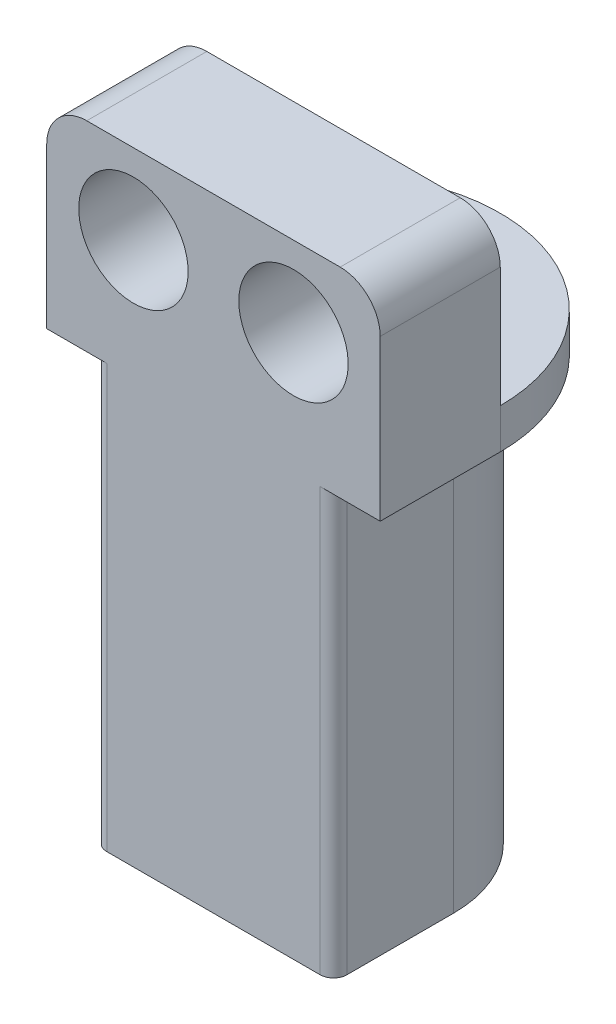
ISO-10303-21;
HEADER;
FILE_DESCRIPTION(('STEP AP214'),'2;1');
FILE_NAME('part.step','',(''),(''),'','','');
FILE_SCHEMA(('AUTOMOTIVE_DESIGN { 1 0 10303 214 1 1 1 1 }'));
ENDSEC;
DATA;
#1=APPLICATION_CONTEXT('core data for automotive mechanical design processes');
#2=APPLICATION_PROTOCOL_DEFINITION('international standard','automotive_design',2000,#1);
#3=PRODUCT_CONTEXT('',#1,'mechanical');
#4=PRODUCT('Part','Part','',(#3));
#5=PRODUCT_RELATED_PRODUCT_CATEGORY('part','',(#4));
#6=PRODUCT_DEFINITION_FORMATION('','',#4);
#7=PRODUCT_DEFINITION_CONTEXT('part definition',#1,'design');
#8=PRODUCT_DEFINITION('design','',#6,#7);
#9=PRODUCT_DEFINITION_SHAPE('','',#8);
#10=(LENGTH_UNIT() NAMED_UNIT(*) SI_UNIT(.MILLI.,.METRE.));
#11=(NAMED_UNIT(*) PLANE_ANGLE_UNIT() SI_UNIT($,.RADIAN.));
#12=(NAMED_UNIT(*) SI_UNIT($,.STERADIAN.) SOLID_ANGLE_UNIT());
#13=UNCERTAINTY_MEASURE_WITH_UNIT(LENGTH_MEASURE(1.E-05),#10,'distance_accuracy_value','');
#14=(GEOMETRIC_REPRESENTATION_CONTEXT(3) GLOBAL_UNCERTAINTY_ASSIGNED_CONTEXT((#13)) GLOBAL_UNIT_ASSIGNED_CONTEXT((#10,
#11,#12)) REPRESENTATION_CONTEXT('',''));
#15=CARTESIAN_POINT('',(0.,0.,0.));
#16=DIRECTION('',(0.,0.,1.));
#17=DIRECTION('',(1.,0.,0.));
#18=AXIS2_PLACEMENT_3D('',#15,#16,#17);
#19=CARTESIAN_POINT('',(0.,8.,0.));
#20=DIRECTION('',(0.,1.,0.));
#21=DIRECTION('',(0.,0.,1.));
#22=AXIS2_PLACEMENT_3D('',#19,#20,#21);
#23=PLANE('',#22);
#24=DIRECTION('',(-1.,0.,0.));
#25=VECTOR('',#24,1.);
#26=CARTESIAN_POINT('',(12.5,8.,0.));
#27=LINE('',#26,#25);
#28=CARTESIAN_POINT('',(12.5,8.,0.));
#29=VERTEX_POINT('',#28);
#30=CARTESIAN_POINT('',(-12.5,8.,0.));
#31=VERTEX_POINT('',#30);
#32=EDGE_CURVE('E204',#29,#31,#27,.T.);
#33=ORIENTED_EDGE('',*,*,#32,.F.);
#34=CARTESIAN_POINT('',(0.,8.,0.));
#35=DIRECTION('',(0.,1.,0.));
#36=DIRECTION('',(0.,0.,1.));
#37=AXIS2_PLACEMENT_3D('',#34,#35,#36);
#38=CIRCLE('',#37,12.5);
#39=EDGE_CURVE('E214',#29,#31,#38,.T.);
#40=ORIENTED_EDGE('',*,*,#39,.T.);
#41=EDGE_LOOP('',(#33,#40));
#42=FACE_BOUND('',#41,.T.);
#43=ADVANCED_FACE('F52',(#42),#23,.T.);
#44=CARTESIAN_POINT('',(-9.,5.,0.));
#45=DIRECTION('',(1.,0.,0.));
#46=DIRECTION('',(0.,0.,-1.));
#47=AXIS2_PLACEMENT_3D('',#44,#45,#46);
#48=PLANE('',#47);
#49=DIRECTION('',(0.,-1.,0.));
#50=VECTOR('',#49,1.);
#51=CARTESIAN_POINT('',(-9.,5.,0.));
#52=LINE('',#51,#50);
#53=CARTESIAN_POINT('',(-9.,5.,0.));
#54=VERTEX_POINT('',#53);
#55=CARTESIAN_POINT('',(-9.,-26.7,0.));
#56=VERTEX_POINT('',#55);
#57=EDGE_CURVE('E160',#54,#56,#52,.T.);
#58=ORIENTED_EDGE('',*,*,#57,.T.);
#59=DIRECTION('',(0.,0.,-1.));
#60=VECTOR('',#59,1.);
#61=CARTESIAN_POINT('',(-9.,-26.7,8.));
#62=LINE('',#61,#60);
#63=CARTESIAN_POINT('',(-9.,-26.7,8.));
#64=VERTEX_POINT('',#63);
#65=EDGE_CURVE('E185',#64,#56,#62,.T.);
#66=ORIENTED_EDGE('',*,*,#65,.F.);
#67=DIRECTION('',(0.,-1.,0.));
#68=VECTOR('',#67,1.);
#69=CARTESIAN_POINT('',(-9.,5.,8.));
#70=LINE('',#69,#68);
#71=CARTESIAN_POINT('',(-9.,5.,8.));
#72=VERTEX_POINT('',#71);
#73=EDGE_CURVE('E249',#64,#72,#70,.F.);
#74=ORIENTED_EDGE('',*,*,#73,.T.);
#75=DIRECTION('',(0.,0.,1.));
#76=VECTOR('',#75,1.);
#77=CARTESIAN_POINT('',(-9.,5.,0.));
#78=LINE('',#77,#76);
#79=EDGE_CURVE('E240',#54,#72,#78,.T.);
#80=ORIENTED_EDGE('',*,*,#79,.F.);
#81=EDGE_LOOP('',(#58,#66,#74,#80));
#82=FACE_BOUND('',#81,.T.);
#83=ADVANCED_FACE('F299',(#82),#48,.F.);
#84=CARTESIAN_POINT('',(9.,5.,9.));
#85=DIRECTION('',(-1.,0.,0.));
#86=DIRECTION('',(0.,0.,1.));
#87=AXIS2_PLACEMENT_3D('',#84,#85,#86);
#88=PLANE('',#87);
#89=DIRECTION('',(0.,0.,-1.));
#90=VECTOR('',#89,1.);
#91=CARTESIAN_POINT('',(9.,5.,9.));
#92=LINE('',#91,#90);
#93=CARTESIAN_POINT('',(9.,5.,8.));
#94=VERTEX_POINT('',#93);
#95=CARTESIAN_POINT('',(9.,5.,0.));
#96=VERTEX_POINT('',#95);
#97=EDGE_CURVE('E243',#94,#96,#92,.T.);
#98=ORIENTED_EDGE('',*,*,#97,.F.);
#99=DIRECTION('',(0.,-1.,0.));
#100=VECTOR('',#99,1.);
#101=CARTESIAN_POINT('',(9.,5.,8.));
#102=LINE('',#101,#100);
#103=CARTESIAN_POINT('',(9.,-26.7,8.));
#104=VERTEX_POINT('',#103);
#105=EDGE_CURVE('E251',#94,#104,#102,.T.);
#106=ORIENTED_EDGE('',*,*,#105,.T.);
#107=DIRECTION('',(0.,0.,1.));
#108=VECTOR('',#107,1.);
#109=CARTESIAN_POINT('',(9.,-26.7,0.));
#110=LINE('',#109,#108);
#111=CARTESIAN_POINT('',(9.,-26.7,0.));
#112=VERTEX_POINT('',#111);
#113=EDGE_CURVE('E176',#112,#104,#110,.T.);
#114=ORIENTED_EDGE('',*,*,#113,.F.);
#115=DIRECTION('',(0.,-1.,0.));
#116=VECTOR('',#115,1.);
#117=CARTESIAN_POINT('',(9.,5.,0.));
#118=LINE('',#117,#116);
#119=EDGE_CURVE('E245',#96,#112,#118,.T.);
#120=ORIENTED_EDGE('',*,*,#119,.F.);
#121=EDGE_LOOP('',(#98,#106,#114,#120));
#122=FACE_BOUND('',#121,.T.);
#123=ADVANCED_FACE('F307',(#122),#88,.F.);
#124=CARTESIAN_POINT('',(0.,5.,0.));
#125=DIRECTION('',(0.,-1.,0.));
#126=DIRECTION('',(0.,0.,-1.));
#127=AXIS2_PLACEMENT_3D('',#124,#125,#126);
#128=CYLINDRICAL_SURFACE('',#127,9.);
#129=ORIENTED_EDGE('',*,*,#119,.T.);
#130=CARTESIAN_POINT('',(0.,-26.7,0.));
#131=DIRECTION('',(0.,-1.,0.));
#132=DIRECTION('',(0.,0.,-1.));
#133=AXIS2_PLACEMENT_3D('',#130,#131,#132);
#134=CIRCLE('',#133,9.);
#135=EDGE_CURVE('E188',#56,#112,#134,.T.);
#136=ORIENTED_EDGE('',*,*,#135,.F.);
#137=ORIENTED_EDGE('',*,*,#57,.F.);
#138=CARTESIAN_POINT('',(0.,5.,0.));
#139=DIRECTION('',(0.,1.,0.));
#140=DIRECTION('',(0.,0.,1.));
#141=AXIS2_PLACEMENT_3D('',#138,#139,#140);
#142=CIRCLE('',#141,9.);
#143=EDGE_CURVE('E238',#96,#54,#142,.T.);
#144=ORIENTED_EDGE('',*,*,#143,.F.);
#145=EDGE_LOOP('',(#129,#136,#137,#144));
#146=FACE_BOUND('',#145,.T.);
#147=ADVANCED_FACE('F303',(#146),#128,.T.);
#148=CARTESIAN_POINT('',(-9.,5.,9.));
#149=DIRECTION('',(0.,0.,-1.));
#150=DIRECTION('',(-1.,0.,0.));
#151=AXIS2_PLACEMENT_3D('',#148,#149,#150);
#152=PLANE('',#151);
#153=CARTESIAN_POINT('',(-6.,14.,9.));
#154=DIRECTION('',(0.,0.,1.));
#155=DIRECTION('',(1.,0.,0.));
#156=AXIS2_PLACEMENT_3D('',#153,#154,#155);
#157=CIRCLE('',#156,4.1);
#158=CARTESIAN_POINT('',(-1.9,14.,9.));
#159=VERTEX_POINT('',#158);
#160=EDGE_CURVE('E208',#159,#159,#157,.T.);
#161=ORIENTED_EDGE('',*,*,#160,.F.);
#162=EDGE_LOOP('',(#161));
#163=FACE_BOUND('',#162,.T.);
#164=CARTESIAN_POINT('',(6.,14.,9.));
#165=DIRECTION('',(0.,0.,1.));
#166=DIRECTION('',(-1.,0.,0.));
#167=AXIS2_PLACEMENT_3D('',#164,#165,#166);
#168=CIRCLE('',#167,4.1);
#169=CARTESIAN_POINT('',(1.9,14.,9.));
#170=VERTEX_POINT('',#169);
#171=EDGE_CURVE('E207',#170,#170,#168,.T.);
#172=ORIENTED_EDGE('',*,*,#171,.F.);
#173=EDGE_LOOP('',(#172));
#174=FACE_BOUND('',#173,.T.);
#175=DIRECTION('',(0.,-1.,0.));
#176=VECTOR('',#175,1.);
#177=CARTESIAN_POINT('',(12.5,8.,9.));
#178=LINE('',#177,#176);
#179=CARTESIAN_POINT('',(12.5,17.,9.));
#180=VERTEX_POINT('',#179);
#181=CARTESIAN_POINT('',(12.5,5.,9.));
#182=VERTEX_POINT('',#181);
#183=EDGE_CURVE('E229',#180,#182,#178,.T.);
#184=ORIENTED_EDGE('',*,*,#183,.F.);
#185=CARTESIAN_POINT('',(9.5,17.,9.));
#186=DIRECTION('',(0.,0.,-1.));
#187=DIRECTION('',(-1.,0.,0.));
#188=AXIS2_PLACEMENT_3D('',#185,#186,#187);
#189=CIRCLE('',#188,3.);
#190=CARTESIAN_POINT('',(9.5,20.,9.));
#191=VERTEX_POINT('',#190);
#192=EDGE_CURVE('E262',#180,#191,#189,.F.);
#193=ORIENTED_EDGE('',*,*,#192,.T.);
#194=DIRECTION('',(1.,0.,0.));
#195=VECTOR('',#194,1.);
#196=CARTESIAN_POINT('',(-9.,20.,9.));
#197=LINE('',#196,#195);
#198=CARTESIAN_POINT('',(-9.5,20.,9.));
#199=VERTEX_POINT('',#198);
#200=EDGE_CURVE('E236',#199,#191,#197,.T.);
#201=ORIENTED_EDGE('',*,*,#200,.F.);
#202=CARTESIAN_POINT('',(-9.5,17.,9.));
#203=DIRECTION('',(0.,0.,-1.));
#204=DIRECTION('',(-1.,0.,0.));
#205=AXIS2_PLACEMENT_3D('',#202,#203,#204);
#206=CIRCLE('',#205,3.);
#207=CARTESIAN_POINT('',(-12.5,17.,9.));
#208=VERTEX_POINT('',#207);
#209=EDGE_CURVE('E260',#199,#208,#206,.F.);
#210=ORIENTED_EDGE('',*,*,#209,.T.);
#211=DIRECTION('',(0.,-1.,0.));
#212=VECTOR('',#211,1.);
#213=CARTESIAN_POINT('',(-12.5,8.,9.));
#214=LINE('',#213,#212);
#215=CARTESIAN_POINT('',(-12.5,5.,9.));
#216=VERTEX_POINT('',#215);
#217=EDGE_CURVE('E231',#208,#216,#214,.T.);
#218=ORIENTED_EDGE('',*,*,#217,.T.);
#219=DIRECTION('',(1.,0.,0.));
#220=VECTOR('',#219,1.);
#221=CARTESIAN_POINT('',(-12.5,5.,9.));
#222=LINE('',#221,#220);
#223=CARTESIAN_POINT('',(-8.,5.,9.));
#224=VERTEX_POINT('',#223);
#225=EDGE_CURVE('E224',#216,#224,#222,.T.);
#226=ORIENTED_EDGE('',*,*,#225,.T.);
#227=DIRECTION('',(0.,-1.,0.));
#228=VECTOR('',#227,1.);
#229=CARTESIAN_POINT('',(-8.,5.,9.));
#230=LINE('',#229,#228);
#231=CARTESIAN_POINT('',(-8.,-26.7,9.));
#232=VERTEX_POINT('',#231);
#233=EDGE_CURVE('E159',#224,#232,#230,.T.);
#234=ORIENTED_EDGE('',*,*,#233,.T.);
#235=DIRECTION('',(-1.,0.,0.));
#236=VECTOR('',#235,1.);
#237=CARTESIAN_POINT('',(8.,-26.7,9.));
#238=LINE('',#237,#236);
#239=CARTESIAN_POINT('',(8.,-26.7,9.));
#240=VERTEX_POINT('',#239);
#241=EDGE_CURVE('E163',#240,#232,#238,.T.);
#242=ORIENTED_EDGE('',*,*,#241,.F.);
#243=DIRECTION('',(0.,-1.,0.));
#244=VECTOR('',#243,1.);
#245=CARTESIAN_POINT('',(8.,5.,9.));
#246=LINE('',#245,#244);
#247=CARTESIAN_POINT('',(7.99999999999999,5.,9.));
#248=VERTEX_POINT('',#247);
#249=EDGE_CURVE('E150',#240,#248,#246,.F.);
#250=ORIENTED_EDGE('',*,*,#249,.T.);
#251=EDGE_CURVE('E223',#248,#182,#222,.T.);
#252=ORIENTED_EDGE('',*,*,#251,.T.);
#253=EDGE_LOOP('',(#184,#193,#201,#210,#218,#226,#234,#242,#250,#252));
#254=FACE_BOUND('',#253,.T.);
#255=ADVANCED_FACE('F165',(#163,#174,#254),#152,.F.);
#256=CARTESIAN_POINT('',(0.,20.,0.));
#257=DIRECTION('',(0.,-1.,0.));
#258=DIRECTION('',(0.,0.,-1.));
#259=AXIS2_PLACEMENT_3D('',#256,#257,#258);
#260=PLANE('',#259);
#261=ORIENTED_EDGE('',*,*,#200,.T.);
#262=DIRECTION('',(0.,0.,1.));
#263=VECTOR('',#262,1.);
#264=CARTESIAN_POINT('',(9.5,20.,0.));
#265=LINE('',#264,#263);
#266=CARTESIAN_POINT('',(9.49999999999999,20.,0.));
#267=VERTEX_POINT('',#266);
#268=EDGE_CURVE('E74',#191,#267,#265,.F.);
#269=ORIENTED_EDGE('',*,*,#268,.T.);
#270=DIRECTION('',(1.,0.,0.));
#271=VECTOR('',#270,1.);
#272=CARTESIAN_POINT('',(-12.5,20.,0.));
#273=LINE('',#272,#271);
#274=CARTESIAN_POINT('',(-9.5,20.,0.));
#275=VERTEX_POINT('',#274);
#276=EDGE_CURVE('E200',#275,#267,#273,.T.);
#277=ORIENTED_EDGE('',*,*,#276,.F.);
#278=DIRECTION('',(0.,0.,-1.));
#279=VECTOR('',#278,1.);
#280=CARTESIAN_POINT('',(-9.5,20.,0.));
#281=LINE('',#280,#279);
#282=EDGE_CURVE('E264',#275,#199,#281,.F.);
#283=ORIENTED_EDGE('',*,*,#282,.T.);
#284=EDGE_LOOP('',(#261,#269,#277,#283));
#285=FACE_BOUND('',#284,.T.);
#286=ADVANCED_FACE('F282',(#285),#260,.F.);
#287=CARTESIAN_POINT('',(0.,5.,0.));
#288=DIRECTION('',(0.,1.,0.));
#289=DIRECTION('',(0.,0.,1.));
#290=AXIS2_PLACEMENT_3D('',#287,#288,#289);
#291=PLANE('',#290);
#292=ORIENTED_EDGE('',*,*,#251,.F.);
#293=CARTESIAN_POINT('',(8.,5.,8.));
#294=DIRECTION('',(0.,1.,0.));
#295=DIRECTION('',(0.,0.,1.));
#296=AXIS2_PLACEMENT_3D('',#293,#294,#295);
#297=CIRCLE('',#296,1.);
#298=EDGE_CURVE('E156',#248,#94,#297,.T.);
#299=ORIENTED_EDGE('',*,*,#298,.T.);
#300=ORIENTED_EDGE('',*,*,#97,.T.);
#301=ORIENTED_EDGE('',*,*,#143,.T.);
#302=ORIENTED_EDGE('',*,*,#79,.T.);
#303=CARTESIAN_POINT('',(-8.,5.,8.));
#304=DIRECTION('',(0.,1.,0.));
#305=DIRECTION('',(0.,0.,1.));
#306=AXIS2_PLACEMENT_3D('',#303,#304,#305);
#307=CIRCLE('',#306,1.);
#308=EDGE_CURVE('E253',#72,#224,#307,.T.);
#309=ORIENTED_EDGE('',*,*,#308,.T.);
#310=ORIENTED_EDGE('',*,*,#225,.F.);
#311=DIRECTION('',(0.,0.,1.));
#312=VECTOR('',#311,1.);
#313=CARTESIAN_POINT('',(-12.5,5.,0.));
#314=LINE('',#313,#312);
#315=CARTESIAN_POINT('',(-12.5,5.,0.));
#316=VERTEX_POINT('',#315);
#317=EDGE_CURVE('E220',#316,#216,#314,.T.);
#318=ORIENTED_EDGE('',*,*,#317,.F.);
#319=CARTESIAN_POINT('',(0.,5.,0.));
#320=DIRECTION('',(0.,1.,0.));
#321=DIRECTION('',(0.,0.,1.));
#322=AXIS2_PLACEMENT_3D('',#319,#320,#321);
#323=CIRCLE('',#322,12.5);
#324=CARTESIAN_POINT('',(12.5,5.,0.));
#325=VERTEX_POINT('',#324);
#326=EDGE_CURVE('E211',#325,#316,#323,.T.);
#327=ORIENTED_EDGE('',*,*,#326,.F.);
#328=DIRECTION('',(0.,0.,-1.));
#329=VECTOR('',#328,1.);
#330=CARTESIAN_POINT('',(12.5,5.,9.));
#331=LINE('',#330,#329);
#332=EDGE_CURVE('E217',#182,#325,#331,.T.);
#333=ORIENTED_EDGE('',*,*,#332,.F.);
#334=EDGE_LOOP('',(#292,#299,#300,#301,#302,#309,#310,#318,#327,#333));
#335=FACE_BOUND('',#334,.T.);
#336=ADVANCED_FACE('F291',(#335),#291,.F.);
#337=CARTESIAN_POINT('',(0.,8.,0.));
#338=DIRECTION('',(0.,-1.,0.));
#339=DIRECTION('',(0.,0.,-1.));
#340=AXIS2_PLACEMENT_3D('',#337,#338,#339);
#341=CYLINDRICAL_SURFACE('',#340,12.5);
#342=ORIENTED_EDGE('',*,*,#326,.T.);
#343=DIRECTION('',(0.,-1.,0.));
#344=VECTOR('',#343,1.);
#345=CARTESIAN_POINT('',(-12.5,8.,0.));
#346=LINE('',#345,#344);
#347=EDGE_CURVE('E233',#31,#316,#346,.T.);
#348=ORIENTED_EDGE('',*,*,#347,.F.);
#349=ORIENTED_EDGE('',*,*,#39,.F.);
#350=DIRECTION('',(0.,-1.,0.));
#351=VECTOR('',#350,1.);
#352=CARTESIAN_POINT('',(12.5,8.,0.));
#353=LINE('',#352,#351);
#354=EDGE_CURVE('E216',#29,#325,#353,.T.);
#355=ORIENTED_EDGE('',*,*,#354,.T.);
#356=EDGE_LOOP('',(#342,#348,#349,#355));
#357=FACE_BOUND('',#356,.T.);
#358=ADVANCED_FACE('F310',(#357),#341,.T.);
#359=CARTESIAN_POINT('',(-12.5,8.,0.));
#360=DIRECTION('',(1.,0.,0.));
#361=DIRECTION('',(0.,0.,-1.));
#362=AXIS2_PLACEMENT_3D('',#359,#360,#361);
#363=PLANE('',#362);
#364=ORIENTED_EDGE('',*,*,#217,.F.);
#365=DIRECTION('',(0.,0.,-1.));
#366=VECTOR('',#365,1.);
#367=CARTESIAN_POINT('',(-12.5,17.,0.));
#368=LINE('',#367,#366);
#369=CARTESIAN_POINT('',(-12.5,17.,0.));
#370=VERTEX_POINT('',#369);
#371=EDGE_CURVE('E14',#208,#370,#368,.T.);
#372=ORIENTED_EDGE('',*,*,#371,.T.);
#373=DIRECTION('',(0.,1.,0.));
#374=VECTOR('',#373,1.);
#375=CARTESIAN_POINT('',(-12.5,8.,0.));
#376=LINE('',#375,#374);
#377=EDGE_CURVE('E197',#31,#370,#376,.T.);
#378=ORIENTED_EDGE('',*,*,#377,.F.);
#379=ORIENTED_EDGE('',*,*,#347,.T.);
#380=ORIENTED_EDGE('',*,*,#317,.T.);
#381=EDGE_LOOP('',(#364,#372,#378,#379,#380));
#382=FACE_BOUND('',#381,.T.);
#383=ADVANCED_FACE('F285',(#382),#363,.F.);
#384=CARTESIAN_POINT('',(12.5,8.,9.));
#385=DIRECTION('',(-1.,0.,0.));
#386=DIRECTION('',(0.,0.,1.));
#387=AXIS2_PLACEMENT_3D('',#384,#385,#386);
#388=PLANE('',#387);
#389=DIRECTION('',(0.,-1.,0.));
#390=VECTOR('',#389,1.);
#391=CARTESIAN_POINT('',(12.5,20.,0.));
#392=LINE('',#391,#390);
#393=CARTESIAN_POINT('',(12.5,17.,0.));
#394=VERTEX_POINT('',#393);
#395=EDGE_CURVE('E202',#394,#29,#392,.T.);
#396=ORIENTED_EDGE('',*,*,#395,.F.);
#397=DIRECTION('',(0.,0.,1.));
#398=VECTOR('',#397,1.);
#399=CARTESIAN_POINT('',(12.5,17.,9.));
#400=LINE('',#399,#398);
#401=EDGE_CURVE('E257',#394,#180,#400,.T.);
#402=ORIENTED_EDGE('',*,*,#401,.T.);
#403=ORIENTED_EDGE('',*,*,#183,.T.);
#404=ORIENTED_EDGE('',*,*,#332,.T.);
#405=ORIENTED_EDGE('',*,*,#354,.F.);
#406=EDGE_LOOP('',(#396,#402,#403,#404,#405));
#407=FACE_BOUND('',#406,.T.);
#408=ADVANCED_FACE('F277',(#407),#388,.F.);
#409=CARTESIAN_POINT('',(6.,14.,-12.5));
#410=DIRECTION('',(0.,0.,1.));
#411=DIRECTION('',(1.,0.,0.));
#412=AXIS2_PLACEMENT_3D('',#409,#410,#411);
#413=CYLINDRICAL_SURFACE('',#412,4.1);
#414=ORIENTED_EDGE('',*,*,#171,.T.);
#415=EDGE_LOOP('',(#414));
#416=FACE_BOUND('',#415,.T.);
#417=CARTESIAN_POINT('',(6.,14.,0.));
#418=DIRECTION('',(0.,0.,-1.));
#419=DIRECTION('',(-1.,0.,0.));
#420=AXIS2_PLACEMENT_3D('',#417,#418,#419);
#421=CIRCLE('',#420,4.1);
#422=CARTESIAN_POINT('',(1.9,14.,0.));
#423=VERTEX_POINT('',#422);
#424=EDGE_CURVE('E194',#423,#423,#421,.T.);
#425=ORIENTED_EDGE('',*,*,#424,.T.);
#426=EDGE_LOOP('',(#425));
#427=FACE_BOUND('',#426,.T.);
#428=ADVANCED_FACE('F321',(#416,#427),#413,.F.);
#429=CARTESIAN_POINT('',(-6.,14.,-12.5));
#430=DIRECTION('',(0.,0.,1.));
#431=DIRECTION('',(1.,0.,0.));
#432=AXIS2_PLACEMENT_3D('',#429,#430,#431);
#433=CYLINDRICAL_SURFACE('',#432,4.1);
#434=ORIENTED_EDGE('',*,*,#160,.T.);
#435=EDGE_LOOP('',(#434));
#436=FACE_BOUND('',#435,.T.);
#437=CARTESIAN_POINT('',(-6.,14.,0.));
#438=DIRECTION('',(0.,0.,-1.));
#439=DIRECTION('',(-1.,0.,0.));
#440=AXIS2_PLACEMENT_3D('',#437,#438,#439);
#441=CIRCLE('',#440,4.1);
#442=CARTESIAN_POINT('',(-10.1,14.,0.));
#443=VERTEX_POINT('',#442);
#444=EDGE_CURVE('E191',#443,#443,#441,.T.);
#445=ORIENTED_EDGE('',*,*,#444,.T.);
#446=EDGE_LOOP('',(#445));
#447=FACE_BOUND('',#446,.T.);
#448=ADVANCED_FACE('F341',(#436,#447),#433,.F.);
#449=CARTESIAN_POINT('',(-8.,5.,8.));
#450=DIRECTION('',(0.,-1.,0.));
#451=DIRECTION('',(0.,0.,-1.));
#452=AXIS2_PLACEMENT_3D('',#449,#450,#451);
#453=CYLINDRICAL_SURFACE('',#452,1.);
#454=ORIENTED_EDGE('',*,*,#308,.F.);
#455=ORIENTED_EDGE('',*,*,#73,.F.);
#456=CARTESIAN_POINT('',(-8.,-26.7,8.));
#457=DIRECTION('',(0.,-1.,0.));
#458=DIRECTION('',(0.,0.,-1.));
#459=AXIS2_PLACEMENT_3D('',#456,#457,#458);
#460=CIRCLE('',#459,0.999999999999999);
#461=EDGE_CURVE('E170',#232,#64,#460,.T.);
#462=ORIENTED_EDGE('',*,*,#461,.F.);
#463=ORIENTED_EDGE('',*,*,#233,.F.);
#464=EDGE_LOOP('',(#454,#455,#462,#463));
#465=FACE_BOUND('',#464,.T.);
#466=ADVANCED_FACE('F295',(#465),#453,.T.);
#467=CARTESIAN_POINT('',(8.,5.,8.));
#468=DIRECTION('',(0.,-1.,0.));
#469=DIRECTION('',(0.,0.,-1.));
#470=AXIS2_PLACEMENT_3D('',#467,#468,#469);
#471=CYLINDRICAL_SURFACE('',#470,1.);
#472=ORIENTED_EDGE('',*,*,#298,.F.);
#473=ORIENTED_EDGE('',*,*,#249,.F.);
#474=CARTESIAN_POINT('',(8.,-26.7,8.));
#475=DIRECTION('',(0.,-1.,0.));
#476=DIRECTION('',(0.,0.,-1.));
#477=AXIS2_PLACEMENT_3D('',#474,#475,#476);
#478=CIRCLE('',#477,0.999999999999999);
#479=EDGE_CURVE('E155',#104,#240,#478,.T.);
#480=ORIENTED_EDGE('',*,*,#479,.F.);
#481=ORIENTED_EDGE('',*,*,#105,.F.);
#482=EDGE_LOOP('',(#472,#473,#480,#481));
#483=FACE_BOUND('',#482,.T.);
#484=ADVANCED_FACE('F152',(#483),#471,.T.);
#485=CARTESIAN_POINT('',(0.,0.,0.));
#486=DIRECTION('',(0.,0.,-1.));
#487=DIRECTION('',(-1.,0.,0.));
#488=AXIS2_PLACEMENT_3D('',#485,#486,#487);
#489=PLANE('',#488);
#490=ORIENTED_EDGE('',*,*,#424,.F.);
#491=EDGE_LOOP('',(#490));
#492=FACE_BOUND('',#491,.T.);
#493=ORIENTED_EDGE('',*,*,#276,.T.);
#494=CARTESIAN_POINT('',(9.5,17.,0.));
#495=DIRECTION('',(0.,0.,-1.));
#496=DIRECTION('',(-1.,0.,0.));
#497=AXIS2_PLACEMENT_3D('',#494,#495,#496);
#498=CIRCLE('',#497,3.);
#499=EDGE_CURVE('E60',#267,#394,#498,.T.);
#500=ORIENTED_EDGE('',*,*,#499,.T.);
#501=ORIENTED_EDGE('',*,*,#395,.T.);
#502=ORIENTED_EDGE('',*,*,#32,.T.);
#503=ORIENTED_EDGE('',*,*,#377,.T.);
#504=CARTESIAN_POINT('',(-9.5,17.,0.));
#505=DIRECTION('',(0.,0.,-1.));
#506=DIRECTION('',(-1.,0.,0.));
#507=AXIS2_PLACEMENT_3D('',#504,#505,#506);
#508=CIRCLE('',#507,3.);
#509=EDGE_CURVE('E67',#370,#275,#508,.T.);
#510=ORIENTED_EDGE('',*,*,#509,.T.);
#511=EDGE_LOOP('',(#493,#500,#501,#502,#503,#510));
#512=FACE_BOUND('',#511,.T.);
#513=ORIENTED_EDGE('',*,*,#444,.F.);
#514=EDGE_LOOP('',(#513));
#515=FACE_BOUND('',#514,.T.);
#516=ADVANCED_FACE('F270',(#492,#512,#515),#489,.T.);
#517=CARTESIAN_POINT('',(9.5,17.,9.));
#518=DIRECTION('',(0.,0.,1.));
#519=DIRECTION('',(1.,0.,0.));
#520=AXIS2_PLACEMENT_3D('',#517,#518,#519);
#521=CYLINDRICAL_SURFACE('',#520,3.);
#522=ORIENTED_EDGE('',*,*,#499,.F.);
#523=ORIENTED_EDGE('',*,*,#268,.F.);
#524=ORIENTED_EDGE('',*,*,#192,.F.);
#525=ORIENTED_EDGE('',*,*,#401,.F.);
#526=EDGE_LOOP('',(#522,#523,#524,#525));
#527=FACE_BOUND('',#526,.T.);
#528=ADVANCED_FACE('F279',(#527),#521,.T.);
#529=CARTESIAN_POINT('',(-9.5,17.,0.));
#530=DIRECTION('',(0.,0.,-1.));
#531=DIRECTION('',(-1.,0.,0.));
#532=AXIS2_PLACEMENT_3D('',#529,#530,#531);
#533=CYLINDRICAL_SURFACE('',#532,3.);
#534=ORIENTED_EDGE('',*,*,#209,.F.);
#535=ORIENTED_EDGE('',*,*,#282,.F.);
#536=ORIENTED_EDGE('',*,*,#509,.F.);
#537=ORIENTED_EDGE('',*,*,#371,.F.);
#538=EDGE_LOOP('',(#534,#535,#536,#537));
#539=FACE_BOUND('',#538,.T.);
#540=ADVANCED_FACE('F54',(#539),#533,.T.);
#541=CARTESIAN_POINT('',(8.,-26.7,8.));
#542=DIRECTION('',(0.,-1.,0.));
#543=DIRECTION('',(0.,0.,-1.));
#544=AXIS2_PLACEMENT_3D('',#541,#542,#543);
#545=PLANE('',#544);
#546=CARTESIAN_POINT('',(0.,-26.7,0.));
#547=DIRECTION('',(0.,-1.,0.));
#548=DIRECTION('',(0.,0.,-1.));
#549=AXIS2_PLACEMENT_3D('',#546,#547,#548);
#550=CIRCLE('',#549,2.05);
#551=CARTESIAN_POINT('',(0.,-26.7,-2.05));
#552=VERTEX_POINT('',#551);
#553=EDGE_CURVE('E180',#552,#552,#550,.T.);
#554=ORIENTED_EDGE('',*,*,#553,.F.);
#555=EDGE_LOOP('',(#554));
#556=FACE_BOUND('',#555,.T.);
#557=ORIENTED_EDGE('',*,*,#479,.T.);
#558=ORIENTED_EDGE('',*,*,#241,.T.);
#559=ORIENTED_EDGE('',*,*,#461,.T.);
#560=ORIENTED_EDGE('',*,*,#65,.T.);
#561=ORIENTED_EDGE('',*,*,#135,.T.);
#562=ORIENTED_EDGE('',*,*,#113,.T.);
#563=EDGE_LOOP('',(#557,#558,#559,#560,#561,#562));
#564=FACE_BOUND('',#563,.T.);
#565=ADVANCED_FACE('F173',(#556,#564),#545,.T.);
#566=CARTESIAN_POINT('',(0.,-21.7,0.));
#567=DIRECTION('',(0.,-1.,0.));
#568=DIRECTION('',(0.,0.,-1.));
#569=AXIS2_PLACEMENT_3D('',#566,#567,#568);
#570=CYLINDRICAL_SURFACE('',#569,2.05);
#571=CARTESIAN_POINT('',(0.,-21.7,0.));
#572=DIRECTION('',(0.,-1.,0.));
#573=DIRECTION('',(0.,0.,-1.));
#574=AXIS2_PLACEMENT_3D('',#571,#572,#573);
#575=CIRCLE('',#574,2.05);
#576=CARTESIAN_POINT('',(0.,-21.7,-2.05));
#577=VERTEX_POINT('',#576);
#578=EDGE_CURVE('E177',#577,#577,#575,.T.);
#579=ORIENTED_EDGE('',*,*,#578,.F.);
#580=EDGE_LOOP('',(#579));
#581=FACE_BOUND('',#580,.T.);
#582=ORIENTED_EDGE('',*,*,#553,.T.);
#583=EDGE_LOOP('',(#582));
#584=FACE_BOUND('',#583,.T.);
#585=ADVANCED_FACE('F477',(#581,#584),#570,.F.);
#586=CARTESIAN_POINT('',(0.,-21.7,0.));
#587=DIRECTION('',(0.,-1.,0.));
#588=DIRECTION('',(0.,0.,-1.));
#589=AXIS2_PLACEMENT_3D('',#586,#587,#588);
#590=PLANE('',#589);
#591=ORIENTED_EDGE('',*,*,#578,.T.);
#592=EDGE_LOOP('',(#591));
#593=FACE_BOUND('',#592,.T.);
#594=ADVANCED_FACE('F488',(#593),#590,.T.);
#595=CLOSED_SHELL('',(#43,#83,#123,#147,#255,#286,#336,#358,#383,#408,#428,#448,#466,#484,#516,
#528,#540,#565,#585,#594));
#596=MANIFOLD_SOLID_BREP('B2',#595);
#597=ADVANCED_BREP_SHAPE_REPRESENTATION('',(#18,#596),#14);
#598=SHAPE_DEFINITION_REPRESENTATION(#9,#597);
ENDSEC;
END-ISO-10303-21;
